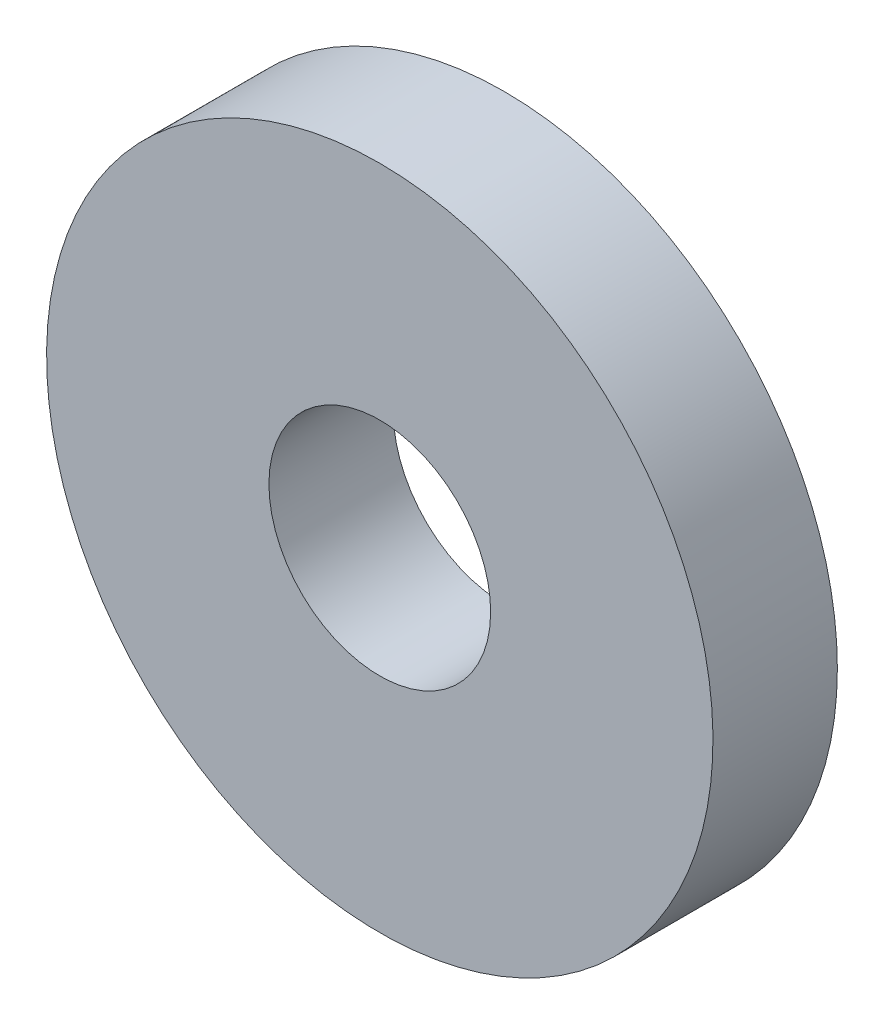
ISO-10303-21;
HEADER;
FILE_DESCRIPTION(('STEP AP214'),'2;1');
FILE_NAME('part.step','',(''),(''),'','','');
FILE_SCHEMA(('AUTOMOTIVE_DESIGN { 1 0 10303 214 1 1 1 1 }'));
ENDSEC;
DATA;
#1=APPLICATION_CONTEXT('core data for automotive mechanical design processes');
#2=APPLICATION_PROTOCOL_DEFINITION('international standard','automotive_design',2000,#1);
#3=PRODUCT_CONTEXT('',#1,'mechanical');
#4=PRODUCT('Part','Part','',(#3));
#5=PRODUCT_RELATED_PRODUCT_CATEGORY('part','',(#4));
#6=PRODUCT_DEFINITION_FORMATION('','',#4);
#7=PRODUCT_DEFINITION_CONTEXT('part definition',#1,'design');
#8=PRODUCT_DEFINITION('design','',#6,#7);
#9=PRODUCT_DEFINITION_SHAPE('','',#8);
#10=(LENGTH_UNIT() NAMED_UNIT(*) SI_UNIT(.MILLI.,.METRE.));
#11=(NAMED_UNIT(*) PLANE_ANGLE_UNIT() SI_UNIT($,.RADIAN.));
#12=(NAMED_UNIT(*) SI_UNIT($,.STERADIAN.) SOLID_ANGLE_UNIT());
#13=UNCERTAINTY_MEASURE_WITH_UNIT(LENGTH_MEASURE(1.E-05),#10,'distance_accuracy_value','');
#14=(GEOMETRIC_REPRESENTATION_CONTEXT(3) GLOBAL_UNCERTAINTY_ASSIGNED_CONTEXT((#13)) GLOBAL_UNIT_ASSIGNED_CONTEXT((#10,
#11,#12)) REPRESENTATION_CONTEXT('',''));
#15=CARTESIAN_POINT('',(0.,0.,0.));
#16=DIRECTION('',(0.,0.,1.));
#17=DIRECTION('',(1.,0.,0.));
#18=AXIS2_PLACEMENT_3D('',#15,#16,#17);
#19=CARTESIAN_POINT('',(0.,0.,24.0132034355964));
#20=DIRECTION('',(0.,0.,-1.));
#21=DIRECTION('',(-1.,0.,0.));
#22=AXIS2_PLACEMENT_3D('',#19,#20,#21);
#23=CYLINDRICAL_SURFACE('',#22,2.49550610533677);
#24=CARTESIAN_POINT('',(0.,0.,2.79999999999997));
#25=DIRECTION('',(0.,0.,-1.));
#26=DIRECTION('',(-0.77207884127484,-0.635526760141302,0.));
#27=AXIS2_PLACEMENT_3D('',#24,#25,#26);
#28=CIRCLE('',#27,2.49550610533672);
#29=CARTESIAN_POINT('',(-1.92672746220266,-1.58596091003746,2.79999999999997));
#30=VERTEX_POINT('',#29);
#31=EDGE_CURVE('E50',#30,#30,#28,.F.);
#32=ORIENTED_EDGE('',*,*,#31,.T.);
#33=EDGE_LOOP('',(#32));
#34=FACE_BOUND('',#33,.T.);
#35=CARTESIAN_POINT('',(0.,0.,0.));
#36=DIRECTION('',(0.,0.,1.));
#37=DIRECTION('',(1.,0.,0.));
#38=AXIS2_PLACEMENT_3D('',#35,#36,#37);
#39=CIRCLE('',#38,2.49550610533677);
#40=CARTESIAN_POINT('',(2.49550610533677,0.,0.));
#41=VERTEX_POINT('',#40);
#42=EDGE_CURVE('E61',#41,#41,#39,.T.);
#43=ORIENTED_EDGE('',*,*,#42,.F.);
#44=EDGE_LOOP('',(#43));
#45=FACE_BOUND('',#44,.T.);
#46=ADVANCED_FACE('F43',(#34,#45),#23,.F.);
#47=CARTESIAN_POINT('',(0.,0.,0.));
#48=DIRECTION('',(0.,0.,1.));
#49=DIRECTION('',(1.,0.,0.));
#50=AXIS2_PLACEMENT_3D('',#47,#48,#49);
#51=PLANE('',#50);
#52=ORIENTED_EDGE('',*,*,#42,.T.);
#53=EDGE_LOOP('',(#52));
#54=FACE_BOUND('',#53,.T.);
#55=CARTESIAN_POINT('',(0.,0.,0.));
#56=DIRECTION('',(0.,0.,1.));
#57=DIRECTION('',(1.,0.,0.));
#58=AXIS2_PLACEMENT_3D('',#55,#56,#57);
#59=CIRCLE('',#58,7.5);
#60=CARTESIAN_POINT('',(7.5,0.,0.));
#61=VERTEX_POINT('',#60);
#62=EDGE_CURVE('E55',#61,#61,#59,.T.);
#63=ORIENTED_EDGE('',*,*,#62,.F.);
#64=EDGE_LOOP('',(#63));
#65=FACE_BOUND('',#64,.T.);
#66=ADVANCED_FACE('F67',(#54,#65),#51,.F.);
#67=CARTESIAN_POINT('',(0.,0.,24.0132034355964));
#68=DIRECTION('',(0.,0.,-1.));
#69=DIRECTION('',(-1.,0.,0.));
#70=AXIS2_PLACEMENT_3D('',#67,#68,#69);
#71=CYLINDRICAL_SURFACE('',#70,7.5);
#72=CARTESIAN_POINT('',(0.,0.,2.79999999999997));
#73=DIRECTION('',(0.,0.,-1.));
#74=DIRECTION('',(0.,1.,0.));
#75=AXIS2_PLACEMENT_3D('',#72,#73,#74);
#76=CIRCLE('',#75,7.5);
#77=CARTESIAN_POINT('',(0.,7.5,2.79999999999997));
#78=VERTEX_POINT('',#77);
#79=EDGE_CURVE('E10',#78,#78,#76,.T.);
#80=ORIENTED_EDGE('',*,*,#79,.T.);
#81=EDGE_LOOP('',(#80));
#82=FACE_BOUND('',#81,.T.);
#83=ORIENTED_EDGE('',*,*,#62,.T.);
#84=EDGE_LOOP('',(#83));
#85=FACE_BOUND('',#84,.T.);
#86=ADVANCED_FACE('F74',(#82,#85),#71,.T.);
#87=CARTESIAN_POINT('',(0.,0.,2.79999999999997));
#88=DIRECTION('',(0.,0.,-1.));
#89=DIRECTION('',(-0.77207884127484,-0.635526760141302,0.));
#90=AXIS2_PLACEMENT_3D('',#87,#88,#89);
#91=PLANE('',#90);
#92=ORIENTED_EDGE('',*,*,#31,.F.);
#93=EDGE_LOOP('',(#92));
#94=FACE_BOUND('',#93,.T.);
#95=ORIENTED_EDGE('',*,*,#79,.F.);
#96=EDGE_LOOP('',(#95));
#97=FACE_BOUND('',#96,.T.);
#98=ADVANCED_FACE('F79',(#94,#97),#91,.F.);
#99=CLOSED_SHELL('',(#46,#66,#86,#98));
#100=MANIFOLD_SOLID_BREP('B2',#99);
#101=ADVANCED_BREP_SHAPE_REPRESENTATION('',(#18,#100),#14);
#102=SHAPE_DEFINITION_REPRESENTATION(#9,#101);
ENDSEC;
END-ISO-10303-21;
